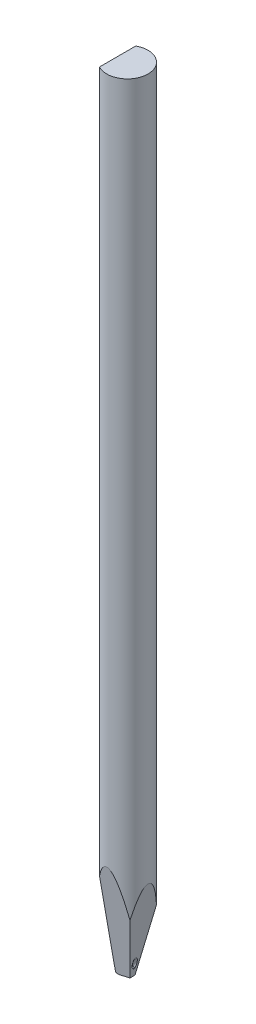
ISO-10303-21;
HEADER;
FILE_DESCRIPTION(('STEP AP214'),'2;1');
FILE_NAME('part.step','',(''),(''),'','','');
FILE_SCHEMA(('AUTOMOTIVE_DESIGN { 1 0 10303 214 1 1 1 1 }'));
ENDSEC;
DATA;
#1=APPLICATION_CONTEXT('core data for automotive mechanical design processes');
#2=APPLICATION_PROTOCOL_DEFINITION('international standard','automotive_design',2000,#1);
#3=PRODUCT_CONTEXT('',#1,'mechanical');
#4=PRODUCT('Part','Part','',(#3));
#5=PRODUCT_RELATED_PRODUCT_CATEGORY('part','',(#4));
#6=PRODUCT_DEFINITION_FORMATION('','',#4);
#7=PRODUCT_DEFINITION_CONTEXT('part definition',#1,'design');
#8=PRODUCT_DEFINITION('design','',#6,#7);
#9=PRODUCT_DEFINITION_SHAPE('','',#8);
#10=(LENGTH_UNIT() NAMED_UNIT(*) SI_UNIT(.MILLI.,.METRE.));
#11=(NAMED_UNIT(*) PLANE_ANGLE_UNIT() SI_UNIT($,.RADIAN.));
#12=(NAMED_UNIT(*) SI_UNIT($,.STERADIAN.) SOLID_ANGLE_UNIT());
#13=UNCERTAINTY_MEASURE_WITH_UNIT(LENGTH_MEASURE(1.E-05),#10,'distance_accuracy_value','');
#14=(GEOMETRIC_REPRESENTATION_CONTEXT(3) GLOBAL_UNCERTAINTY_ASSIGNED_CONTEXT((#13)) GLOBAL_UNIT_ASSIGNED_CONTEXT((#10,
#11,#12)) REPRESENTATION_CONTEXT('',''));
#15=CARTESIAN_POINT('',(0.,0.,0.));
#16=DIRECTION('',(0.,0.,1.));
#17=DIRECTION('',(1.,0.,0.));
#18=AXIS2_PLACEMENT_3D('',#15,#16,#17);
#19=CARTESIAN_POINT('',(38.6493213378097,0.,0.0762));
#20=DIRECTION('',(0.,-0.173648177666931,0.984807753012208));
#21=DIRECTION('',(0.,-0.984807753012208,-0.173648177666931));
#22=AXIS2_PLACEMENT_3D('',#19,#20,#21);
#23=PLANE('',#22);
#24=CARTESIAN_POINT('',(-0.32512,0.0508,0.0851574106199918));
#25=DIRECTION('',(0.,-0.173648177666931,0.984807753012208));
#26=DIRECTION('',(0.,-0.984807753012208,-0.173648177666931));
#27=AXIS2_PLACEMENT_3D('',#24,#25,#26);
#28=ELLIPSE('',#27,0.0515836718837959,0.0508);
#29=CARTESIAN_POINT('',(-0.32512,0.,0.0762000000000017));
#30=VERTEX_POINT('',#29);
#31=CARTESIAN_POINT('',(-0.37592,0.0508,0.0851574106199918));
#32=VERTEX_POINT('',#31);
#33=EDGE_CURVE('E68',#30,#32,#28,.F.);
#34=ORIENTED_EDGE('',*,*,#33,.F.);
#35=DIRECTION('',(-1.,0.,0.));
#36=VECTOR('',#35,1.);
#37=CARTESIAN_POINT('',(38.6493213378097,0.,0.0762));
#38=LINE('',#37,#36);
#39=CARTESIAN_POINT('',(-0.241300000000003,0.,0.0761999999999997));
#40=VERTEX_POINT('',#39);
#41=EDGE_CURVE('E417',#40,#30,#38,.T.);
#42=ORIENTED_EDGE('',*,*,#41,.F.);
#43=DIRECTION('',(-0.964921520309631,-0.258549942126377,-0.0455893306574928));
#44=VECTOR('',#43,1.);
#45=CARTESIAN_POINT('',(35.9687284956643,9.70244789332123,1.78700334251055));
#46=LINE('',#45,#44);
#47=CARTESIAN_POINT('',(0.195917050620486,0.117151955630876,0.0968570506204847));
#48=VERTEX_POINT('',#47);
#49=EDGE_CURVE('E414',#48,#40,#46,.T.);
#50=ORIENTED_EDGE('',*,*,#49,.F.);
#51=DIRECTION('',(-0.171087869746036,-0.970287525247814,-0.171087869746036));
#52=VECTOR('',#51,1.);
#53=CARTESIAN_POINT('',(1.30143652609224,6.3868644581071,1.20237652609224));
#54=LINE('',#53,#52);
#55=CARTESIAN_POINT('',(0.607704752474526,2.45251606269785,0.508644752474526));
#56=VERTEX_POINT('',#55);
#57=EDGE_CURVE('E411',#56,#48,#54,.T.);
#58=ORIENTED_EDGE('',*,*,#57,.F.);
#59=CARTESIAN_POINT('',(0.,-0.432151674654869,0.));
#60=DIRECTION('',(0.,-0.173648177666931,0.984807753012208));
#61=DIRECTION('',(0.,-0.984807753012208,-0.173648177666931));
#62=AXIS2_PLACEMENT_3D('',#59,#60,#61);
#63=ELLIPSE('',#62,4.56371043248163,0.792479999999998);
#64=CARTESIAN_POINT('',(-0.37592,3.52439037249585,0.69764511322018));
#65=VERTEX_POINT('',#64);
#66=EDGE_CURVE('E422',#56,#65,#63,.T.);
#67=ORIENTED_EDGE('',*,*,#66,.T.);
#68=DIRECTION('',(0.,0.984807753012208,0.173648177666931));
#69=VECTOR('',#68,1.);
#70=CARTESIAN_POINT('',(-0.37592,29.4106524144287,5.26209154090237));
#71=LINE('',#70,#69);
#72=EDGE_CURVE('E437',#32,#65,#71,.T.);
#73=ORIENTED_EDGE('',*,*,#72,.F.);
#74=EDGE_LOOP('',(#34,#42,#50,#58,#67,#73));
#75=FACE_BOUND('',#74,.T.);
#76=ADVANCED_FACE('F46',(#75),#23,.T.);
#77=CARTESIAN_POINT('',(38.6493213378097,0.,-0.0762));
#78=DIRECTION('',(0.,-0.173648177666931,-0.984807753012208));
#79=DIRECTION('',(0.,0.984807753012208,-0.173648177666931));
#80=AXIS2_PLACEMENT_3D('',#77,#78,#79);
#81=PLANE('',#80);
#82=CARTESIAN_POINT('',(-0.32512,0.0508,-0.0851574106199918));
#83=DIRECTION('',(0.,-0.173648177666931,-0.984807753012208));
#84=DIRECTION('',(0.,0.984807753012208,-0.173648177666931));
#85=AXIS2_PLACEMENT_3D('',#82,#83,#84);
#86=ELLIPSE('',#85,0.0515836718837959,0.0508);
#87=CARTESIAN_POINT('',(-0.37592,0.0508,-0.0851574106199918));
#88=VERTEX_POINT('',#87);
#89=CARTESIAN_POINT('',(-0.32512,0.,-0.0762000000000017));
#90=VERTEX_POINT('',#89);
#91=EDGE_CURVE('E482',#88,#90,#86,.F.);
#92=ORIENTED_EDGE('',*,*,#91,.F.);
#93=DIRECTION('',(0.,-0.984807753012208,0.173648177666931));
#94=VECTOR('',#93,1.);
#95=CARTESIAN_POINT('',(-0.37592,29.6851167322043,-5.31048700536795));
#96=LINE('',#95,#94);
#97=CARTESIAN_POINT('',(-0.37592,3.52439037249585,-0.69764511322018));
#98=VERTEX_POINT('',#97);
#99=EDGE_CURVE('E439',#98,#88,#96,.T.);
#100=ORIENTED_EDGE('',*,*,#99,.F.);
#101=CARTESIAN_POINT('',(0.,-0.432151674654869,0.));
#102=DIRECTION('',(0.,-0.173648177666931,-0.984807753012208));
#103=DIRECTION('',(0.,-0.984807753012208,0.173648177666931));
#104=AXIS2_PLACEMENT_3D('',#101,#102,#103);
#105=ELLIPSE('',#104,4.56371043248163,0.792479999999998);
#106=CARTESIAN_POINT('',(0.607704752474526,2.45251606269785,-0.508644752474526));
#107=VERTEX_POINT('',#106);
#108=EDGE_CURVE('E425',#98,#107,#105,.T.);
#109=ORIENTED_EDGE('',*,*,#108,.T.);
#110=DIRECTION('',(0.171087869746036,0.970287525247814,-0.171087869746036));
#111=VECTOR('',#110,1.);
#112=CARTESIAN_POINT('',(1.30143652609224,6.3868644581071,-1.20237652609224));
#113=LINE('',#112,#111);
#114=CARTESIAN_POINT('',(0.195917050620486,0.117151955630876,-0.0968570506204847));
#115=VERTEX_POINT('',#114);
#116=EDGE_CURVE('E441',#115,#107,#113,.T.);
#117=ORIENTED_EDGE('',*,*,#116,.F.);
#118=DIRECTION('',(0.964921520309631,0.258549942126377,-0.0455893306574928));
#119=VECTOR('',#118,1.);
#120=CARTESIAN_POINT('',(35.9687284956643,9.70244789332123,-1.78700334251055));
#121=LINE('',#120,#119);
#122=CARTESIAN_POINT('',(-0.241300000000003,0.,-0.0761999999999997));
#123=VERTEX_POINT('',#122);
#124=EDGE_CURVE('E444',#123,#115,#121,.T.);
#125=ORIENTED_EDGE('',*,*,#124,.F.);
#126=DIRECTION('',(-1.,0.,0.));
#127=VECTOR('',#126,1.);
#128=CARTESIAN_POINT('',(38.6493213378097,0.,-0.0762));
#129=LINE('',#128,#127);
#130=EDGE_CURVE('E419',#123,#90,#129,.T.);
#131=ORIENTED_EDGE('',*,*,#130,.T.);
#132=EDGE_LOOP('',(#92,#100,#109,#117,#125,#131));
#133=FACE_BOUND('',#132,.T.);
#134=ADVANCED_FACE('F291',(#133),#81,.T.);
#135=CARTESIAN_POINT('',(-0.375920000000002,0.,0.02794));
#136=DIRECTION('',(0.,0.499999999999998,0.86602540378444));
#137=DIRECTION('',(0.,-0.86602540378444,0.499999999999998));
#138=AXIS2_PLACEMENT_3D('',#135,#136,#137);
#139=PLANE('',#138);
#140=DIRECTION('',(1.,0.,0.));
#141=VECTOR('',#140,1.);
#142=CARTESIAN_POINT('',(-0.375920000000002,0.,0.02794));
#143=LINE('',#142,#141);
#144=CARTESIAN_POINT('',(-0.32512,0.,0.0279399999999927));
#145=VERTEX_POINT('',#144);
#146=CARTESIAN_POINT('',(-0.255156139621714,0.,0.02794));
#147=VERTEX_POINT('',#146);
#148=EDGE_CURVE('E393',#145,#147,#143,.T.);
#149=ORIENTED_EDGE('',*,*,#148,.F.);
#150=CARTESIAN_POINT('',(-0.32512,0.0508,-0.0013893936748402));
#151=DIRECTION('',(0.,0.499999999999998,0.86602540378444));
#152=DIRECTION('',(0.,0.86602540378444,-0.499999999999998));
#153=AXIS2_PLACEMENT_3D('',#150,#151,#152);
#154=ELLIPSE('',#153,0.0586587873496659,0.0508);
#155=CARTESIAN_POINT('',(-0.355777192017303,0.0102934995634744,0.0219970452561248));
#156=VERTEX_POINT('',#155);
#157=EDGE_CURVE('E205',#145,#156,#154,.F.);
#158=ORIENTED_EDGE('',*,*,#157,.T.);
#159=DIRECTION('',(1.,0.,0.));
#160=VECTOR('',#159,1.);
#161=CARTESIAN_POINT('',(-0.375920000000002,0.0102934995634744,0.0219970452561248));
#162=LINE('',#161,#160);
#163=CARTESIAN_POINT('',(-0.255223979228152,0.0102934995634744,0.0219970452561248));
#164=VERTEX_POINT('',#163);
#165=EDGE_CURVE('E54',#156,#164,#162,.T.);
#166=ORIENTED_EDGE('',*,*,#165,.T.);
#167=CARTESIAN_POINT('',(-0.19730590948775,0.0483934995634747,0.));
#168=DIRECTION('',(0.,0.499999999999998,0.86602540378444));
#169=DIRECTION('',(-0.554700196225233,-0.720576692122891,0.416025147168919));
#170=AXIS2_PLACEMENT_3D('',#167,#168,#169);
#171=ELLIPSE('',#170,0.0879881810244995,0.0381);
#172=EDGE_CURVE('E252',#164,#147,#171,.T.);
#173=ORIENTED_EDGE('',*,*,#172,.T.);
#174=EDGE_LOOP('',(#149,#158,#166,#173));
#175=FACE_BOUND('',#174,.T.);
#176=ADVANCED_FACE('F288',(#175),#139,.F.);
#177=CARTESIAN_POINT('',(-0.375920000000002,0.0102934995634744,-0.0219970452561248));
#178=DIRECTION('',(0.,0.499999999999998,-0.86602540378444));
#179=DIRECTION('',(0.,0.86602540378444,0.499999999999998));
#180=AXIS2_PLACEMENT_3D('',#177,#178,#179);
#181=PLANE('',#180);
#182=DIRECTION('',(1.,0.,0.));
#183=VECTOR('',#182,1.);
#184=CARTESIAN_POINT('',(-0.375920000000002,0.0102934995634744,-0.0219970452561248));
#185=LINE('',#184,#183);
#186=CARTESIAN_POINT('',(-0.355777192017306,0.0102934995634744,-0.0219970452561248));
#187=VERTEX_POINT('',#186);
#188=CARTESIAN_POINT('',(-0.255223979228152,0.0102934995634744,-0.0219970452561248));
#189=VERTEX_POINT('',#188);
#190=EDGE_CURVE('E244',#187,#189,#185,.T.);
#191=ORIENTED_EDGE('',*,*,#190,.F.);
#192=CARTESIAN_POINT('',(-0.32512,0.0508,0.00138939367482632));
#193=DIRECTION('',(0.,0.499999999999998,-0.86602540378444));
#194=DIRECTION('',(0.,-0.86602540378444,-0.499999999999998));
#195=AXIS2_PLACEMENT_3D('',#192,#193,#194);
#196=ELLIPSE('',#195,0.0586587873496659,0.0508);
#197=CARTESIAN_POINT('',(-0.32512,0.,-0.0279400000000065));
#198=VERTEX_POINT('',#197);
#199=EDGE_CURVE('E212',#187,#198,#196,.F.);
#200=ORIENTED_EDGE('',*,*,#199,.T.);
#201=DIRECTION('',(1.,0.,0.));
#202=VECTOR('',#201,1.);
#203=CARTESIAN_POINT('',(-0.375920000000002,0.,-0.02794));
#204=LINE('',#203,#202);
#205=CARTESIAN_POINT('',(-0.255156139621714,0.,-0.02794));
#206=VERTEX_POINT('',#205);
#207=EDGE_CURVE('E246',#198,#206,#204,.T.);
#208=ORIENTED_EDGE('',*,*,#207,.T.);
#209=CARTESIAN_POINT('',(-0.19730590948775,0.0483934995634747,0.));
#210=DIRECTION('',(0.,0.499999999999998,-0.86602540378444));
#211=DIRECTION('',(-0.554700196225232,-0.720576692122891,-0.416025147168919));
#212=AXIS2_PLACEMENT_3D('',#209,#210,#211);
#213=ELLIPSE('',#212,0.0879881810244996,0.0381);
#214=EDGE_CURVE('E447',#206,#189,#213,.T.);
#215=ORIENTED_EDGE('',*,*,#214,.T.);
#216=EDGE_LOOP('',(#191,#200,#208,#215));
#217=FACE_BOUND('',#216,.T.);
#218=ADVANCED_FACE('F290',(#217),#181,.F.);
#219=CARTESIAN_POINT('',(0.,0.,0.));
#220=DIRECTION('',(0.,1.,0.));
#221=DIRECTION('',(0.,0.,1.));
#222=AXIS2_PLACEMENT_3D('',#219,#220,#221);
#223=PLANE('',#222);
#224=ORIENTED_EDGE('',*,*,#41,.T.);
#225=DIRECTION('',(0.,0.,-1.));
#226=VECTOR('',#225,1.);
#227=CARTESIAN_POINT('',(-0.32512,0.,38.2146171183694));
#228=LINE('',#227,#226);
#229=EDGE_CURVE('E214',#30,#145,#228,.T.);
#230=ORIENTED_EDGE('',*,*,#229,.T.);
#231=ORIENTED_EDGE('',*,*,#148,.T.);
#232=CARTESIAN_POINT('',(-0.22524590948775,0.,0.));
#233=DIRECTION('',(0.,1.,0.));
#234=DIRECTION('',(-1.,0.,0.));
#235=AXIS2_PLACEMENT_3D('',#232,#233,#234);
#236=ELLIPSE('',#235,0.0439940905122496,0.0381);
#237=CARTESIAN_POINT('',(-0.2413,0.,0.0354726603649658));
#238=VERTEX_POINT('',#237);
#239=EDGE_CURVE('E256',#238,#147,#236,.F.);
#240=ORIENTED_EDGE('',*,*,#239,.F.);
#241=DIRECTION('',(0.,0.,-1.));
#242=VECTOR('',#241,1.);
#243=CARTESIAN_POINT('',(-0.2413,0.,39.0514777293349));
#244=LINE('',#243,#242);
#245=EDGE_CURVE('E405',#40,#238,#244,.T.);
#246=ORIENTED_EDGE('',*,*,#245,.F.);
#247=EDGE_LOOP('',(#224,#230,#231,#240,#246));
#248=FACE_BOUND('',#247,.T.);
#249=ADVANCED_FACE('F297',(#248),#223,.F.);
#250=ORIENTED_EDGE('',*,*,#207,.F.);
#251=EDGE_CURVE('E216',#198,#90,#228,.T.);
#252=ORIENTED_EDGE('',*,*,#251,.T.);
#253=ORIENTED_EDGE('',*,*,#130,.F.);
#254=CARTESIAN_POINT('',(-0.2413,0.,-0.0354726603649658));
#255=VERTEX_POINT('',#254);
#256=EDGE_CURVE('E398',#255,#123,#244,.T.);
#257=ORIENTED_EDGE('',*,*,#256,.F.);
#258=EDGE_CURVE('E480',#206,#255,#236,.F.);
#259=ORIENTED_EDGE('',*,*,#258,.F.);
#260=EDGE_LOOP('',(#250,#252,#253,#257,#259));
#261=FACE_BOUND('',#260,.T.);
#262=ADVANCED_FACE('F318',(#261),#223,.F.);
#263=CARTESIAN_POINT('',(0.,30.48,0.));
#264=DIRECTION('',(0.,-1.,0.));
#265=DIRECTION('',(0.,0.,-1.));
#266=AXIS2_PLACEMENT_3D('',#263,#264,#265);
#267=CYLINDRICAL_SURFACE('',#266,0.792479999999998);
#268=ORIENTED_EDGE('',*,*,#66,.F.);
#269=CARTESIAN_POINT('',(0.,-0.993948851706197,0.));
#270=DIRECTION('',(-0.984807753012208,0.173648177666931,0.));
#271=DIRECTION('',(-0.173648177666931,-0.984807753012208,0.));
#272=AXIS2_PLACEMENT_3D('',#269,#270,#271);
#273=ELLIPSE('',#272,4.56371043248165,0.792479999999998);
#274=EDGE_CURVE('E408',#56,#107,#273,.T.);
#275=ORIENTED_EDGE('',*,*,#274,.T.);
#276=ORIENTED_EDGE('',*,*,#108,.F.);
#277=DIRECTION('',(0.,-1.,0.));
#278=VECTOR('',#277,1.);
#279=CARTESIAN_POINT('',(-0.37592,30.48,-0.69764511322018));
#280=LINE('',#279,#278);
#281=CARTESIAN_POINT('',(-0.37592,30.48,-0.69764511322018));
#282=VERTEX_POINT('',#281);
#283=EDGE_CURVE('E431',#282,#98,#280,.T.);
#284=ORIENTED_EDGE('',*,*,#283,.F.);
#285=CARTESIAN_POINT('',(0.,30.48,0.));
#286=DIRECTION('',(0.,1.,0.));
#287=DIRECTION('',(0.,0.,1.));
#288=AXIS2_PLACEMENT_3D('',#285,#286,#287);
#289=CIRCLE('',#288,0.792479999999998);
#290=CARTESIAN_POINT('',(-0.37592,30.48,0.69764511322018));
#291=VERTEX_POINT('',#290);
#292=EDGE_CURVE('E434',#291,#282,#289,.T.);
#293=ORIENTED_EDGE('',*,*,#292,.F.);
#294=DIRECTION('',(0.,-1.,0.));
#295=VECTOR('',#294,1.);
#296=CARTESIAN_POINT('',(-0.37592,30.48,0.69764511322018));
#297=LINE('',#296,#295);
#298=EDGE_CURVE('E429',#65,#291,#297,.F.);
#299=ORIENTED_EDGE('',*,*,#298,.F.);
#300=EDGE_LOOP('',(#268,#275,#276,#284,#293,#299));
#301=FACE_BOUND('',#300,.T.);
#302=ADVANCED_FACE('F314',(#301),#267,.T.);
#303=CARTESIAN_POINT('',(-0.37592,30.48,-0.80247998));
#304=DIRECTION('',(-1.,0.,0.));
#305=DIRECTION('',(0.,0.,1.));
#306=AXIS2_PLACEMENT_3D('',#303,#304,#305);
#307=PLANE('',#306);
#308=DIRECTION('',(0.,0.,-1.));
#309=VECTOR('',#308,1.);
#310=CARTESIAN_POINT('',(-0.37592,0.0508,38.2146171183694));
#311=LINE('',#310,#309);
#312=EDGE_CURVE('E76',#32,#88,#311,.T.);
#313=ORIENTED_EDGE('',*,*,#312,.F.);
#314=ORIENTED_EDGE('',*,*,#72,.T.);
#315=ORIENTED_EDGE('',*,*,#298,.T.);
#316=DIRECTION('',(0.,0.,-1.));
#317=VECTOR('',#316,1.);
#318=CARTESIAN_POINT('',(-0.37592,30.48,-0.80247998));
#319=LINE('',#318,#317);
#320=EDGE_CURVE('E427',#291,#282,#319,.T.);
#321=ORIENTED_EDGE('',*,*,#320,.T.);
#322=ORIENTED_EDGE('',*,*,#283,.T.);
#323=ORIENTED_EDGE('',*,*,#99,.T.);
#324=EDGE_LOOP('',(#313,#314,#315,#321,#322,#323));
#325=FACE_BOUND('',#324,.T.);
#326=ADVANCED_FACE('F310',(#325),#307,.T.);
#327=CARTESIAN_POINT('',(0.,30.48,0.));
#328=DIRECTION('',(0.,1.,0.));
#329=DIRECTION('',(0.,0.,1.));
#330=AXIS2_PLACEMENT_3D('',#327,#328,#329);
#331=PLANE('',#330);
#332=ORIENTED_EDGE('',*,*,#292,.T.);
#333=ORIENTED_EDGE('',*,*,#320,.F.);
#334=EDGE_LOOP('',(#332,#333));
#335=FACE_BOUND('',#334,.T.);
#336=ADVANCED_FACE('F313',(#335),#331,.T.);
#337=CARTESIAN_POINT('',(-0.2413,0.,39.0514777293349));
#338=DIRECTION('',(-0.258819045102522,0.965925826289068,0.));
#339=DIRECTION('',(-0.965925826289068,-0.258819045102522,0.));
#340=AXIS2_PLACEMENT_3D('',#337,#338,#339);
#341=PLANE('',#340);
#342=ORIENTED_EDGE('',*,*,#245,.T.);
#343=CARTESIAN_POINT('',(-0.222307807006681,0.00508894277505577,0.));
#344=DIRECTION('',(-0.258819045102522,0.965925826289068,0.));
#345=DIRECTION('',(-0.965925826289068,-0.258819045102522,0.));
#346=AXIS2_PLACEMENT_3D('',#343,#344,#345);
#347=ELLIPSE('',#346,0.0538815367264152,0.0381);
#348=CARTESIAN_POINT('',(-0.222307807006681,0.00508894277505577,0.0380999999999996));
#349=VERTEX_POINT('',#348);
#350=EDGE_CURVE('E450',#238,#349,#347,.T.);
#351=ORIENTED_EDGE('',*,*,#350,.T.);
#352=DIRECTION('',(-0.965925826289068,-0.258819045102522,0.));
#353=VECTOR('',#352,1.);
#354=CARTESIAN_POINT('',(-0.2413,0.,0.0380999999999992));
#355=LINE('',#354,#353);
#356=CARTESIAN_POINT('',(-0.0152400000000001,0.0605725944409798,0.0380999999999996));
#357=VERTEX_POINT('',#356);
#358=EDGE_CURVE('E388',#357,#349,#355,.T.);
#359=ORIENTED_EDGE('',*,*,#358,.F.);
#360=DIRECTION('',(0.,0.,1.));
#361=VECTOR('',#360,1.);
#362=CARTESIAN_POINT('',(-0.0152400000000001,0.0605725944409798,39.0514777293349));
#363=LINE('',#362,#361);
#364=CARTESIAN_POINT('',(-0.0152400000000001,0.0605725944409798,-0.0380999999999996));
#365=VERTEX_POINT('',#364);
#366=EDGE_CURVE('E454',#365,#357,#363,.T.);
#367=ORIENTED_EDGE('',*,*,#366,.F.);
#368=DIRECTION('',(-0.965925826289068,-0.258819045102522,0.));
#369=VECTOR('',#368,1.);
#370=CARTESIAN_POINT('',(-0.2413,0.,-0.0380999999999992));
#371=LINE('',#370,#369);
#372=CARTESIAN_POINT('',(-0.222307807006681,0.00508894277505579,-0.0380999999999996));
#373=VERTEX_POINT('',#372);
#374=EDGE_CURVE('E451',#365,#373,#371,.T.);
#375=ORIENTED_EDGE('',*,*,#374,.T.);
#376=EDGE_CURVE('E255',#373,#255,#347,.T.);
#377=ORIENTED_EDGE('',*,*,#376,.T.);
#378=ORIENTED_EDGE('',*,*,#256,.T.);
#379=ORIENTED_EDGE('',*,*,#124,.T.);
#380=DIRECTION('',(0.,0.,-1.));
#381=VECTOR('',#380,1.);
#382=CARTESIAN_POINT('',(0.195917050620484,0.117151955630877,39.0514777293349));
#383=LINE('',#382,#381);
#384=EDGE_CURVE('E394',#48,#115,#383,.T.);
#385=ORIENTED_EDGE('',*,*,#384,.F.);
#386=ORIENTED_EDGE('',*,*,#49,.T.);
#387=EDGE_LOOP('',(#342,#351,#359,#367,#375,#377,#378,#379,#385,#386));
#388=FACE_BOUND('',#387,.T.);
#389=ADVANCED_FACE('F307',(#388),#341,.F.);
#390=CARTESIAN_POINT('',(0.195917050620484,0.117151955630877,39.0514777293349));
#391=DIRECTION('',(-0.984807753012208,0.173648177666931,0.));
#392=DIRECTION('',(-0.173648177666931,-0.984807753012208,0.));
#393=AXIS2_PLACEMENT_3D('',#390,#391,#392);
#394=PLANE('',#393);
#395=CARTESIAN_POINT('',(0.281397331604712,0.601934719112537,0.));
#396=DIRECTION('',(-0.984807753012208,0.173648177666931,0.));
#397=DIRECTION('',(0.173648177666931,0.984807753012208,0.));
#398=AXIS2_PLACEMENT_3D('',#395,#396,#397);
#399=ELLIPSE('',#398,0.202183515578444,0.0935003785343583);
#400=CARTESIAN_POINT('',(0.316506130639202,0.801046612785453,0.));
#401=VERTEX_POINT('',#400);
#402=EDGE_CURVE('E403',#401,#401,#399,.F.);
#403=ORIENTED_EDGE('',*,*,#402,.F.);
#404=EDGE_LOOP('',(#403));
#405=FACE_BOUND('',#404,.T.);
#406=ORIENTED_EDGE('',*,*,#274,.F.);
#407=ORIENTED_EDGE('',*,*,#57,.T.);
#408=ORIENTED_EDGE('',*,*,#384,.T.);
#409=ORIENTED_EDGE('',*,*,#116,.T.);
#410=EDGE_LOOP('',(#406,#407,#408,#409));
#411=FACE_BOUND('',#410,.T.);
#412=ADVANCED_FACE('F577',(#405,#411),#394,.F.);
#413=CARTESIAN_POINT('',(-0.375920000000002,-0.00240650043652551,0.));
#414=DIRECTION('',(1.,0.,0.));
#415=DIRECTION('',(0.,0.,-1.));
#416=AXIS2_PLACEMENT_3D('',#413,#414,#415);
#417=CYLINDRICAL_SURFACE('',#416,0.0254);
#418=ORIENTED_EDGE('',*,*,#165,.F.);
#419=CARTESIAN_POINT('',(-0.355777192017281,0.0102934995634582,0.0219970452561342));
#420=CARTESIAN_POINT('',(-0.356897506758149,0.0111382333345344,0.0215102767995388));
#421=CARTESIAN_POINT('',(-0.357959364560408,0.0120178983620328,0.0209365131040323));
#422=CARTESIAN_POINT('',(-0.359948169598718,0.0137951368126314,0.0195935481232055));
#423=CARTESIAN_POINT('',(-0.360874227541202,0.0146927880160747,0.0188231418931034));
#424=CARTESIAN_POINT('',(-0.362564583958771,0.0164480441904997,0.0170650442521407));
#425=CARTESIAN_POINT('',(-0.363327716591907,0.0173053284187433,0.0160758836099099));
#426=CARTESIAN_POINT('',(-0.364666012957556,0.0188965230331408,0.013897805568381));
#427=CARTESIAN_POINT('',(-0.365241860716513,0.0196308775171999,0.0127096396622511));
#428=CARTESIAN_POINT('',(-0.366141085408193,0.0208267273040765,0.0103391708506556));
#429=CARTESIAN_POINT('',(-0.366487980815477,0.0213116208054562,0.00917750420896743));
#430=CARTESIAN_POINT('',(-0.367045134166993,0.0221091990654056,0.00676421887909321));
#431=CARTESIAN_POINT('',(-0.367255295955485,0.0224217626121618,0.00551253757499208));
#432=CARTESIAN_POINT('',(-0.367532731202619,0.0228382740127658,0.00305127054038452));
#433=CARTESIAN_POINT('',(-0.367608984240567,0.0229553038487369,0.00184487979962939));
#434=CARTESIAN_POINT('',(-0.367648569413078,0.0230157866563225,-0.000573634748391043));
#435=CARTESIAN_POINT('',(-0.367611955478027,0.0229593225273086,-0.00178575554134157));
#436=CARTESIAN_POINT('',(-0.367426062655835,0.0226776884275995,-0.00416710022693685));
#437=CARTESIAN_POINT('',(-0.367278084000554,0.022454465656123,-0.0053366570969131));
#438=CARTESIAN_POINT('',(-0.366867968064253,0.0218538732504223,-0.0076145582222737));
#439=CARTESIAN_POINT('',(-0.36660582620177,0.0214764974299475,-0.00872290001903533));
#440=CARTESIAN_POINT('',(-0.365962334852267,0.0205866745755416,-0.0108542410743825));
#441=CARTESIAN_POINT('',(-0.365580354877547,0.0200735154530778,-0.0118767518347564));
#442=CARTESIAN_POINT('',(-0.364696727834242,0.0189435363974493,-0.0138052745256558));
#443=CARTESIAN_POINT('',(-0.364195111080501,0.0183267427359919,-0.0147113158790819));
#444=CARTESIAN_POINT('',(-0.36305481672829,0.0170008493560201,-0.0164234611595084));
#445=CARTESIAN_POINT('',(-0.362411777196039,0.0162891892774924,-0.0172246647097102));
#446=CARTESIAN_POINT('',(-0.361009199588909,0.0148331219035069,-0.0186820668489172));
#447=CARTESIAN_POINT('',(-0.360249533840548,0.0140886793650823,-0.0193381045763725));
#448=CARTESIAN_POINT('',(-0.358311130020784,0.0123111425027417,-0.0207435732320806));
#449=CARTESIAN_POINT('',(-0.357084580560832,0.0112788410358154,-0.0214294475133679));
#450=CARTESIAN_POINT('',(-0.355777192022161,0.0102934995630371,-0.0219970452622823));
#451=B_SPLINE_CURVE_WITH_KNOTS('',3,(#419,#420,#421,#422,#423,#424,#425,#426,#427,#428,#429,
#430,#431,#432,#433,#434,#435,#436,#437,#438,#439,#440,#441,#442,#443,#444,#445,#446,#447,#448,
#449,#450),.UNSPECIFIED.,.F.,.F.,(4,2,2,2,2,2,2,2,2,2,2,2,2,2,2,4),(0.,0.00445833921989925,
0.00894468214029065,0.0134621250529331,0.0179628784811104,0.0218592766679201,0.0257584119814633,
0.0293843607519162,0.03300857723086,0.03659112343515,0.0401738134232079,0.0437756778837301,
0.0473766306332142,0.0511100051136513,0.054847496140866,0.0600443644275329),.UNSPECIFIED.);
#452=CARTESIAN_POINT('',(-0.363315096791987,0.0173239368664957,0.0159942904877789));
#453=VERTEX_POINT('',#452);
#454=EDGE_CURVE('E200',#156,#453,#451,.T.);
#455=ORIENTED_EDGE('',*,*,#454,.T.);
#456=CARTESIAN_POINT('',(-0.37592,0.0102934995634744,-0.0219970452561248));
#457=CARTESIAN_POINT('',(-0.369569798070561,0.0141311966671354,-0.0197813498002579));
#458=CARTESIAN_POINT('',(-0.363217008232766,0.0173745492397743,-0.0165382169336048));
#459=CARTESIAN_POINT('',(-0.353697991767233,0.0218065403994241,-0.0088617830663952));
#460=CARTESIAN_POINT('',(-0.35052,0.0229934995634745,-0.00442283642435689));
#461=CARTESIAN_POINT('',(-0.35052,0.0229934995634745,0.00442283642435697));
#462=CARTESIAN_POINT('',(-0.353697991767233,0.0218065403994241,0.00886178306639529));
#463=CARTESIAN_POINT('',(-0.363217008232766,0.0173745492397743,0.0165382169336048));
#464=CARTESIAN_POINT('',(-0.369569798070561,0.0141311966671356,0.0197813498002578));
#465=CARTESIAN_POINT('',(-0.37592,0.0102934995634744,0.0219970452561248));
#466=(BOUNDED_CURVE() B_SPLINE_CURVE(3,(#456,#457,#458,#459,#460,#461,#462,#463,#464,#465),
.UNSPECIFIED.,.F.,.F.) B_SPLINE_CURVE_WITH_KNOTS((4,2,2,2,4),(3.66519142918809,4.18879020478639,
4.71238898038469,5.23598775598299,5.75958653158129),
.UNSPECIFIED.) CURVE() GEOMETRIC_REPRESENTATION_ITEM() RATIONAL_B_SPLINE_CURVE((1.,1.,1.,1.,1.,
1.,1.,1.,1.,1.)) REPRESENTATION_ITEM(''));
#467=CARTESIAN_POINT('',(-0.36331971310046,0.0173215990313243,-0.0159971552315507));
#468=VERTEX_POINT('',#467);
#469=EDGE_CURVE('E60',#453,#468,#466,.F.);
#470=ORIENTED_EDGE('',*,*,#469,.T.);
#471=EDGE_CURVE('E206',#468,#187,#451,.T.);
#472=ORIENTED_EDGE('',*,*,#471,.T.);
#473=ORIENTED_EDGE('',*,*,#190,.T.);
#474=CARTESIAN_POINT('',(-0.255223979228154,0.0102934995634582,0.0219970452561342));
#475=CARTESIAN_POINT('',(-0.258632221061746,0.0142994444352138,0.0196842119060712));
#476=CARTESIAN_POINT('',(-0.263795630476338,0.0171677640360435,0.0167530393669271));
#477=CARTESIAN_POINT('',(-0.273639026010204,0.0216051054798955,0.00934124932685019));
#478=CARTESIAN_POINT('',(-0.27796431872125,0.0229937489838684,0.00471136202422672));
#479=CARTESIAN_POINT('',(-0.277959165397351,0.0229932500719133,-0.00471405100212225));
#480=CARTESIAN_POINT('',(-0.273626024291389,0.0215887905236355,-0.00937809016700787));
#481=CARTESIAN_POINT('',(-0.263790669209007,0.0171541152544561,-0.0167661825480054));
#482=CARTESIAN_POINT('',(-0.258611158336117,0.0142753227786995,-0.0196981385509493));
#483=CARTESIAN_POINT('',(-0.255223979228152,0.0102934995634735,-0.0219970452561253));
#484=(BOUNDED_CURVE() B_SPLINE_CURVE(3,(#474,#475,#476,#477,#478,#479,#480,#481,#482,#483),
.UNSPECIFIED.,.F.,.F.) B_SPLINE_CURVE_WITH_KNOTS((4,2,2,2,4),(0.,1.3240080529018E-05,
2.64801610580349E-05,3.97202415870518E-05,5.29603221160687E-05),
.UNSPECIFIED.) CURVE() GEOMETRIC_REPRESENTATION_ITEM() RATIONAL_B_SPLINE_CURVE((1.,1.,1.,1.,1.,
1.,1.,1.,1.,1.)) REPRESENTATION_ITEM(''));
#485=EDGE_CURVE('E386',#189,#164,#484,.F.);
#486=ORIENTED_EDGE('',*,*,#485,.T.);
#487=EDGE_LOOP('',(#418,#455,#470,#472,#473,#486));
#488=FACE_BOUND('',#487,.T.);
#489=ADVANCED_FACE('F201',(#488),#417,.F.);
#490=CARTESIAN_POINT('',(-0.0152400000000001,0.20828,0.0381));
#491=DIRECTION('',(-1.,0.,0.));
#492=DIRECTION('',(0.,-1.,0.));
#493=AXIS2_PLACEMENT_3D('',#490,#491,#492);
#494=PLANE('',#493);
#495=ORIENTED_EDGE('',*,*,#366,.T.);
#496=DIRECTION('',(0.,1.,0.));
#497=VECTOR('',#496,1.);
#498=CARTESIAN_POINT('',(-0.0152400000000001,0.20828,0.0381));
#499=LINE('',#498,#497);
#500=CARTESIAN_POINT('',(-0.0152400000000001,0.175901226088686,0.0381));
#501=VERTEX_POINT('',#500);
#502=EDGE_CURVE('E465',#357,#501,#499,.T.);
#503=ORIENTED_EDGE('',*,*,#502,.T.);
#504=CARTESIAN_POINT('',(-0.0152400000000001,0.20828,0.));
#505=DIRECTION('',(1.,0.,0.));
#506=DIRECTION('',(0.,1.,0.));
#507=AXIS2_PLACEMENT_3D('',#504,#505,#506);
#508=ELLIPSE('',#507,0.0628617928474838,0.0444500000000001);
#509=CARTESIAN_POINT('',(-0.0152400000000001,0.175901226088686,-0.0381));
#510=VERTEX_POINT('',#509);
#511=EDGE_CURVE('E504',#510,#501,#508,.F.);
#512=ORIENTED_EDGE('',*,*,#511,.F.);
#513=DIRECTION('',(0.,1.,0.));
#514=VECTOR('',#513,1.);
#515=CARTESIAN_POINT('',(-0.0152400000000001,0.20828,-0.0381));
#516=LINE('',#515,#514);
#517=EDGE_CURVE('E514',#365,#510,#516,.T.);
#518=ORIENTED_EDGE('',*,*,#517,.F.);
#519=EDGE_LOOP('',(#495,#503,#512,#518));
#520=FACE_BOUND('',#519,.T.);
#521=ADVANCED_FACE('F546',(#520),#494,.T.);
#522=CARTESIAN_POINT('',(0.,0.,0.0381));
#523=DIRECTION('',(0.,0.,-1.));
#524=DIRECTION('',(-1.,0.,0.));
#525=AXIS2_PLACEMENT_3D('',#522,#523,#524);
#526=PLANE('',#525);
#527=ORIENTED_EDGE('',*,*,#358,.T.);
#528=DIRECTION('',(-0.500000000000004,-0.866025403784436,0.));
#529=VECTOR('',#528,1.);
#530=CARTESIAN_POINT('',(-0.168934432115812,0.0975343398574616,0.0381));
#531=LINE('',#530,#529);
#532=CARTESIAN_POINT('',(-0.104995395420934,0.20828,0.0381));
#533=VERTEX_POINT('',#532);
#534=EDGE_CURVE('E462',#533,#349,#531,.T.);
#535=ORIENTED_EDGE('',*,*,#534,.F.);
#536=DIRECTION('',(-1.,0.,0.));
#537=VECTOR('',#536,1.);
#538=CARTESIAN_POINT('',(-0.148989485933184,0.20828,0.0381));
#539=LINE('',#538,#537);
#540=CARTESIAN_POINT('',(-0.0476187739113147,0.20828,0.0381));
#541=VERTEX_POINT('',#540);
#542=EDGE_CURVE('E508',#541,#533,#539,.T.);
#543=ORIENTED_EDGE('',*,*,#542,.F.);
#544=CARTESIAN_POINT('',(-0.0152400000000001,0.20828,0.0380999999999992));
#545=VERTEX_POINT('',#544);
#546=EDGE_CURVE('E505',#545,#541,#539,.T.);
#547=ORIENTED_EDGE('',*,*,#546,.F.);
#548=EDGE_CURVE('E503',#501,#545,#499,.T.);
#549=ORIENTED_EDGE('',*,*,#548,.F.);
#550=ORIENTED_EDGE('',*,*,#502,.F.);
#551=EDGE_LOOP('',(#527,#535,#543,#547,#549,#550));
#552=FACE_BOUND('',#551,.T.);
#553=ADVANCED_FACE('F460',(#552),#526,.T.);
#554=CARTESIAN_POINT('',(0.,0.,-0.0381));
#555=DIRECTION('',(0.,0.,-1.));
#556=DIRECTION('',(-1.,0.,0.));
#557=AXIS2_PLACEMENT_3D('',#554,#555,#556);
#558=PLANE('',#557);
#559=ORIENTED_EDGE('',*,*,#517,.T.);
#560=CARTESIAN_POINT('',(-0.0152400000000001,0.20828,-0.0380999999999992));
#561=VERTEX_POINT('',#560);
#562=EDGE_CURVE('E512',#510,#561,#516,.T.);
#563=ORIENTED_EDGE('',*,*,#562,.T.);
#564=DIRECTION('',(-1.,0.,0.));
#565=VECTOR('',#564,1.);
#566=CARTESIAN_POINT('',(-0.148989485933184,0.20828,-0.0381));
#567=LINE('',#566,#565);
#568=CARTESIAN_POINT('',(-0.0476187739113147,0.20828,-0.0381));
#569=VERTEX_POINT('',#568);
#570=EDGE_CURVE('E510',#561,#569,#567,.T.);
#571=ORIENTED_EDGE('',*,*,#570,.T.);
#572=CARTESIAN_POINT('',(-0.104995395420934,0.20828,-0.0381));
#573=VERTEX_POINT('',#572);
#574=EDGE_CURVE('E513',#569,#573,#567,.T.);
#575=ORIENTED_EDGE('',*,*,#574,.T.);
#576=DIRECTION('',(0.500000000000004,0.866025403784436,0.));
#577=VECTOR('',#576,1.);
#578=CARTESIAN_POINT('',(-0.104995395420934,0.20828,-0.0381));
#579=LINE('',#578,#577);
#580=EDGE_CURVE('E471',#373,#573,#579,.T.);
#581=ORIENTED_EDGE('',*,*,#580,.F.);
#582=ORIENTED_EDGE('',*,*,#374,.F.);
#583=EDGE_LOOP('',(#559,#563,#571,#575,#581,#582));
#584=FACE_BOUND('',#583,.T.);
#585=ADVANCED_FACE('F528',(#584),#558,.F.);
#586=CARTESIAN_POINT('',(0.207817674108744,0.431337674108742,0.));
#587=DIRECTION('',(0.707106781186551,0.707106781186544,0.));
#588=DIRECTION('',(-0.707106781186544,0.707106781186551,0.));
#589=AXIS2_PLACEMENT_3D('',#586,#587,#588);
#590=CONICAL_SURFACE('',#589,0.0444500000000001,0.392699081698725);
#591=CARTESIAN_POINT('',(0.207817674108744,0.431337674108742,0.));
#592=DIRECTION('',(0.707106781186551,0.707106781186544,0.));
#593=DIRECTION('',(-0.707106781186544,0.707106781186551,0.));
#594=AXIS2_PLACEMENT_3D('',#591,#592,#593);
#595=CIRCLE('',#594,0.0444500000000001);
#596=CARTESIAN_POINT('',(0.176386777685002,0.462768570532484,0.));
#597=VERTEX_POINT('',#596);
#598=EDGE_CURVE('E491',#597,#597,#595,.T.);
#599=ORIENTED_EDGE('',*,*,#598,.F.);
#600=EDGE_LOOP('',(#599));
#601=FACE_BOUND('',#600,.T.);
#602=ORIENTED_EDGE('',*,*,#402,.T.);
#603=EDGE_LOOP('',(#602));
#604=FACE_BOUND('',#603,.T.);
#605=ADVANCED_FACE('F235',(#601,#604),#590,.F.);
#606=CARTESIAN_POINT('',(-0.104995395420934,0.20828,0.));
#607=DIRECTION('',(-0.500000000000004,-0.866025403784436,0.));
#608=DIRECTION('',(0.866025403784437,-0.500000000000004,0.));
#609=AXIS2_PLACEMENT_3D('',#606,#607,#608);
#610=CYLINDRICAL_SURFACE('',#609,0.0381);
#611=ORIENTED_EDGE('',*,*,#172,.F.);
#612=CARTESIAN_POINT('',(-0.255223979228152,0.0102934995634735,-0.0219970452561253));
#613=CARTESIAN_POINT('',(-0.252106046426284,0.0152488664053298,-0.0223117439674125));
#614=CARTESIAN_POINT('',(-0.249840010269763,0.02315922956441,-0.0197490569926841));
#615=CARTESIAN_POINT('',(-0.246257640154765,0.0366451438484652,-0.0117209008729293));
#616=CARTESIAN_POINT('',(-0.244968235622533,0.0420394102786046,-0.00588166411813177));
#617=CARTESIAN_POINT('',(-0.244964112791895,0.0420475887074921,0.00587830289576238));
#618=CARTESIAN_POINT('',(-0.246258547622459,0.0366759137655714,0.0116759247374899));
#619=CARTESIAN_POINT('',(-0.249840839291182,0.0231799560310837,0.0197338672407513));
#620=CARTESIAN_POINT('',(-0.252086532725598,0.0152772523253517,0.022315571395712));
#621=CARTESIAN_POINT('',(-0.255223979228154,0.0102934995634582,0.0219970452561342));
#622=(BOUNDED_CURVE() B_SPLINE_CURVE(3,(#612,#613,#614,#615,#616,#617,#618,#619,#620,#621),
.UNSPECIFIED.,.F.,.F.) B_SPLINE_CURVE_WITH_KNOTS((4,2,2,2,4),(0.,1.3240080529018E-05,
2.64801610580349E-05,3.97202415870518E-05,5.29603221160687E-05),
.UNSPECIFIED.) CURVE() GEOMETRIC_REPRESENTATION_ITEM() RATIONAL_B_SPLINE_CURVE((1.,1.,1.,1.,1.,
1.,1.,1.,1.,1.)) REPRESENTATION_ITEM(''));
#623=EDGE_CURVE('E196',#164,#189,#622,.F.);
#624=ORIENTED_EDGE('',*,*,#623,.T.);
#625=ORIENTED_EDGE('',*,*,#214,.F.);
#626=ORIENTED_EDGE('',*,*,#258,.T.);
#627=ORIENTED_EDGE('',*,*,#376,.F.);
#628=ORIENTED_EDGE('',*,*,#580,.T.);
#629=CARTESIAN_POINT('',(-0.104995395420934,0.20828,0.));
#630=DIRECTION('',(0.,-1.,0.));
#631=DIRECTION('',(-1.,0.,0.));
#632=AXIS2_PLACEMENT_3D('',#629,#630,#631);
#633=ELLIPSE('',#632,0.0439940905122496,0.0381);
#634=EDGE_CURVE('E470',#573,#533,#633,.F.);
#635=ORIENTED_EDGE('',*,*,#634,.T.);
#636=ORIENTED_EDGE('',*,*,#534,.T.);
#637=ORIENTED_EDGE('',*,*,#350,.F.);
#638=ORIENTED_EDGE('',*,*,#239,.T.);
#639=EDGE_LOOP('',(#611,#624,#625,#626,#627,#628,#635,#636,#637,#638));
#640=FACE_BOUND('',#639,.T.);
#641=ADVANCED_FACE('F274',(#640),#610,.F.);
#642=CARTESIAN_POINT('',(-0.148989485933184,0.20828,0.0381));
#643=DIRECTION('',(0.,-1.,0.));
#644=DIRECTION('',(0.,0.,-1.));
#645=AXIS2_PLACEMENT_3D('',#642,#643,#644);
#646=PLANE('',#645);
#647=ORIENTED_EDGE('',*,*,#574,.F.);
#648=CARTESIAN_POINT('',(-0.0152400000000002,0.20828,0.));
#649=DIRECTION('',(0.,1.,0.));
#650=DIRECTION('',(1.,0.,0.));
#651=AXIS2_PLACEMENT_3D('',#648,#649,#650);
#652=ELLIPSE('',#651,0.0628617928474845,0.0444500000000001);
#653=EDGE_CURVE('E499',#541,#569,#652,.F.);
#654=ORIENTED_EDGE('',*,*,#653,.F.);
#655=ORIENTED_EDGE('',*,*,#542,.T.);
#656=ORIENTED_EDGE('',*,*,#634,.F.);
#657=EDGE_LOOP('',(#647,#654,#655,#656));
#658=FACE_BOUND('',#657,.T.);
#659=ADVANCED_FACE('F286',(#658),#646,.T.);
#660=CARTESIAN_POINT('',(-0.0152400000000001,0.20828,38.2270463378097));
#661=DIRECTION('',(1.,0.,0.));
#662=DIRECTION('',(0.,1.,0.));
#663=AXIS2_PLACEMENT_3D('',#660,#661,#662);
#664=PLANE('',#663);
#665=CARTESIAN_POINT('',(-0.0152400000000001,0.20828,-0.0444500000000014));
#666=VERTEX_POINT('',#665);
#667=EDGE_CURVE('E500',#666,#510,#508,.F.);
#668=ORIENTED_EDGE('',*,*,#667,.F.);
#669=DIRECTION('',(0.,0.,-1.));
#670=VECTOR('',#669,1.);
#671=CARTESIAN_POINT('',(-0.0152400000000001,0.20828,38.2270463378097));
#672=LINE('',#671,#670);
#673=EDGE_CURVE('E484',#561,#666,#672,.T.);
#674=ORIENTED_EDGE('',*,*,#673,.F.);
#675=ORIENTED_EDGE('',*,*,#562,.F.);
#676=EDGE_LOOP('',(#668,#674,#675));
#677=FACE_BOUND('',#676,.T.);
#678=ADVANCED_FACE('F550',(#677),#664,.T.);
#679=CARTESIAN_POINT('',(-0.148989485933184,0.20828,38.2270463378097));
#680=DIRECTION('',(0.,1.,0.));
#681=DIRECTION('',(0.,0.,1.));
#682=AXIS2_PLACEMENT_3D('',#679,#680,#681);
#683=PLANE('',#682);
#684=ORIENTED_EDGE('',*,*,#673,.T.);
#685=EDGE_CURVE('E494',#569,#666,#652,.F.);
#686=ORIENTED_EDGE('',*,*,#685,.F.);
#687=ORIENTED_EDGE('',*,*,#570,.F.);
#688=EDGE_LOOP('',(#684,#686,#687));
#689=FACE_BOUND('',#688,.T.);
#690=ADVANCED_FACE('F552',(#689),#683,.T.);
#691=CARTESIAN_POINT('',(-0.330831792847487,-0.107311792847484,0.));
#692=DIRECTION('',(0.707106781186551,0.707106781186544,0.));
#693=DIRECTION('',(-0.707106781186544,0.707106781186551,0.));
#694=AXIS2_PLACEMENT_3D('',#691,#692,#693);
#695=CYLINDRICAL_SURFACE('',#694,0.0444500000000001);
#696=ORIENTED_EDGE('',*,*,#667,.T.);
#697=ORIENTED_EDGE('',*,*,#511,.T.);
#698=CARTESIAN_POINT('',(-0.0152400000000001,0.20828,0.0444500000000014));
#699=VERTEX_POINT('',#698);
#700=EDGE_CURVE('E498',#501,#699,#508,.F.);
#701=ORIENTED_EDGE('',*,*,#700,.T.);
#702=EDGE_CURVE('E495',#699,#541,#652,.F.);
#703=ORIENTED_EDGE('',*,*,#702,.T.);
#704=ORIENTED_EDGE('',*,*,#653,.T.);
#705=ORIENTED_EDGE('',*,*,#685,.T.);
#706=EDGE_LOOP('',(#696,#697,#701,#703,#704,#705));
#707=FACE_BOUND('',#706,.T.);
#708=ORIENTED_EDGE('',*,*,#598,.T.);
#709=EDGE_LOOP('',(#708));
#710=FACE_BOUND('',#709,.T.);
#711=ADVANCED_FACE('F539',(#707,#710),#695,.F.);
#712=ORIENTED_EDGE('',*,*,#548,.T.);
#713=EDGE_CURVE('E488',#699,#545,#672,.T.);
#714=ORIENTED_EDGE('',*,*,#713,.F.);
#715=ORIENTED_EDGE('',*,*,#700,.F.);
#716=EDGE_LOOP('',(#712,#714,#715));
#717=FACE_BOUND('',#716,.T.);
#718=ADVANCED_FACE('F535',(#717),#664,.T.);
#719=ORIENTED_EDGE('',*,*,#546,.T.);
#720=ORIENTED_EDGE('',*,*,#702,.F.);
#721=ORIENTED_EDGE('',*,*,#713,.T.);
#722=EDGE_LOOP('',(#719,#720,#721));
#723=FACE_BOUND('',#722,.T.);
#724=ADVANCED_FACE('F330',(#723),#683,.T.);
#725=CARTESIAN_POINT('',(-0.255223979228152,0.0102934995634735,-0.0219970452561253));
#726=CARTESIAN_POINT('',(-0.258611158336117,0.0142753227786995,-0.0196981385509493));
#727=CARTESIAN_POINT('',(-0.263790669209007,0.0171541152544561,-0.0167661825480054));
#728=CARTESIAN_POINT('',(-0.273626024291389,0.0215887905236355,-0.00937809016700787));
#729=CARTESIAN_POINT('',(-0.277959165397351,0.0229932500719133,-0.00471405100212225));
#730=CARTESIAN_POINT('',(-0.27796431872125,0.0229937489838684,0.00471136202422672));
#731=CARTESIAN_POINT('',(-0.273639026010204,0.0216051054798955,0.00934124932685019));
#732=CARTESIAN_POINT('',(-0.263795630476338,0.0171677640360435,0.0167530393669271));
#733=CARTESIAN_POINT('',(-0.258632221061746,0.0142994444352138,0.0196842119060712));
#734=CARTESIAN_POINT('',(-0.255223979228154,0.0102934995634582,0.0219970452561342));
#735=CARTESIAN_POINT('',(-0.255223979228152,0.0102934995634735,-0.0219970452561253));
#736=CARTESIAN_POINT('',(-0.254835766383677,0.0140413016762542,-0.0198376278601264));
#737=CARTESIAN_POINT('',(-0.255527766209828,0.0181784173948872,-0.0156905446401909));
#738=CARTESIAN_POINT('',(-0.256122520655397,0.0226538500984645,-0.00695128599353588));
#739=CARTESIAN_POINT('',(-0.255964959425929,0.0229924756174879,-0.00321472750080264));
#740=CARTESIAN_POINT('',(-0.255964434241631,0.0229945235452494,0.00321312163581786));
#741=CARTESIAN_POINT('',(-0.256122941749733,0.0226653146908639,0.00691622015713984));
#742=CARTESIAN_POINT('',(-0.255528919551854,0.0181923640918275,0.0156740635339029));
#743=CARTESIAN_POINT('',(-0.254831211331567,0.014081118797927,0.0198157618803997));
#744=CARTESIAN_POINT('',(-0.255223979228154,0.0102934995634582,0.0219970452561342));
#745=CARTESIAN_POINT('',(-0.255223979228152,0.0102934995634735,-0.0219970452561253));
#746=CARTESIAN_POINT('',(-0.252106046426284,0.0152488664053298,-0.0223117439674125));
#747=CARTESIAN_POINT('',(-0.249840010269763,0.02315922956441,-0.0197490569926841));
#748=CARTESIAN_POINT('',(-0.246257640154765,0.0366451438484652,-0.0117209008729293));
#749=CARTESIAN_POINT('',(-0.244968235622533,0.0420394102786046,-0.00588166411813177));
#750=CARTESIAN_POINT('',(-0.244964112791895,0.0420475887074921,0.00587830289576238));
#751=CARTESIAN_POINT('',(-0.246258547622459,0.0366759137655714,0.0116759247374899));
#752=CARTESIAN_POINT('',(-0.249840839291182,0.0231799560310837,0.0197338672407513));
#753=CARTESIAN_POINT('',(-0.252086532725598,0.0152772523253517,0.022315571395712));
#754=CARTESIAN_POINT('',(-0.255223979228154,0.0102934995634582,0.0219970452561342));
#755=(BOUNDED_SURFACE() B_SPLINE_SURFACE(2,3,((#725,#726,#727,#728,#729,#730,#731,#732,#733,
#734),(#735,#736,#737,#738,#739,#740,#741,#742,#743,#744),(#745,#746,#747,#748,#749,#750,#751,
#752,#753,#754)),.UNSPECIFIED.,.F.,.F.,.F.) B_SPLINE_SURFACE_WITH_KNOTS((3,3),(4,2,2,2,4),(0.,
1.),(0.,1.3240080529018E-05,2.64801610580349E-05,3.97202415870518E-05,5.29603221160687E-05),
.UNSPECIFIED.) GEOMETRIC_REPRESENTATION_ITEM() RATIONAL_B_SPLINE_SURFACE(((1.,1.,1.,1.,1.,1.,1.,
1.,1.,1.),(0.923072084192762,0.926772248273631,0.910329457387484,0.880189155000575,
0.866050569959001,0.866000238272667,0.880051152052174,0.910249677373178,0.926645450914712,
0.923072084192793),(1.,1.,1.,1.,1.,1.,1.,1.,1.,1.))) REPRESENTATION_ITEM('') SURFACE());
#756=ORIENTED_EDGE('',*,*,#485,.F.);
#757=ORIENTED_EDGE('',*,*,#623,.F.);
#758=EDGE_LOOP('',(#756,#757));
#759=FACE_BOUND('',#758,.T.);
#760=ADVANCED_FACE('F324',(#759),#755,.T.);
#761=CARTESIAN_POINT('',(-0.37592,0.0102934995634744,-0.0219970452561248));
#762=CARTESIAN_POINT('',(-0.37592,0.017296716219621,-0.0252814442730138));
#763=CARTESIAN_POINT('',(-0.375920000000002,0.0268577090061178,-0.0255262622361604));
#764=CARTESIAN_POINT('',(-0.375919999999997,0.0425693178602632,-0.0173362377638396));
#765=CARTESIAN_POINT('',(-0.37592,0.0483934995634816,-0.00876445199471846));
#766=CARTESIAN_POINT('',(-0.37592,0.0483934995634816,0.00876445199471868));
#767=CARTESIAN_POINT('',(-0.375919999999997,0.0425693178602632,0.0173362377638398));
#768=CARTESIAN_POINT('',(-0.375920000000002,0.0268577090061178,0.0255262622361605));
#769=CARTESIAN_POINT('',(-0.37592,0.0172967162196174,0.0252814442730122));
#770=CARTESIAN_POINT('',(-0.37592,0.0102934995634744,0.0219970452561248));
#771=CARTESIAN_POINT('',(-0.37592,0.0102934995634744,-0.0219970452561248));
#772=CARTESIAN_POINT('',(-0.375920000000021,0.0141342018639847,-0.0197795366841733));
#773=CARTESIAN_POINT('',(-0.37592000000001,0.0173745492397785,-0.016538216933599));
#774=CARTESIAN_POINT('',(-0.37592,0.0218065403994227,-0.00886178306639626));
#775=CARTESIAN_POINT('',(-0.375920000000007,0.0229934995634746,-0.00442283642435589));
#776=CARTESIAN_POINT('',(-0.375920000000007,0.0229934995634745,0.00442283642435602));
#777=CARTESIAN_POINT('',(-0.37592,0.0218065403994228,0.00886178306639637));
#778=CARTESIAN_POINT('',(-0.37592000000001,0.0173745492397784,0.0165382169335989));
#779=CARTESIAN_POINT('',(-0.375920000000021,0.0141342018639819,0.0197795366841749));
#780=CARTESIAN_POINT('',(-0.37592,0.0102934995634744,0.0219970452561248));
#781=CARTESIAN_POINT('',(-0.37592,0.0102934995634744,-0.0219970452561248));
#782=CARTESIAN_POINT('',(-0.369569798070561,0.0141311966671354,-0.0197813498002579));
#783=CARTESIAN_POINT('',(-0.363217008232766,0.0173745492397743,-0.0165382169336048));
#784=CARTESIAN_POINT('',(-0.353697991767233,0.0218065403994241,-0.0088617830663952));
#785=CARTESIAN_POINT('',(-0.35052,0.0229934995634745,-0.00442283642435689));
#786=CARTESIAN_POINT('',(-0.35052,0.0229934995634745,0.00442283642435697));
#787=CARTESIAN_POINT('',(-0.353697991767233,0.0218065403994241,0.00886178306639529));
#788=CARTESIAN_POINT('',(-0.363217008232766,0.0173745492397743,0.0165382169336048));
#789=CARTESIAN_POINT('',(-0.369569798070561,0.0141311966671356,0.0197813498002578));
#790=CARTESIAN_POINT('',(-0.37592,0.0102934995634744,0.0219970452561248));
#791=(BOUNDED_SURFACE() B_SPLINE_SURFACE(2,3,((#761,#762,#763,#764,#765,#766,#767,#768,#769,
#770),(#771,#772,#773,#774,#775,#776,#777,#778,#779,#780),(#781,#782,#783,#784,#785,#786,#787,
#788,#789,#790)),.UNSPECIFIED.,.F.,.F.,.F.) B_SPLINE_SURFACE_WITH_KNOTS((3,3),(4,2,2,2,4),(0.,
1.),(3.66519142918809,4.18879020478639,4.71238898038469,5.23598775598299,5.75958653158129),
.UNSPECIFIED.) GEOMETRIC_REPRESENTATION_ITEM() RATIONAL_B_SPLINE_SURFACE(((1.,1.,1.,1.,1.,1.,1.,
1.,1.,1.),(0.707106781186548,0.707106781186548,0.707106781186452,0.707106781186452,
0.707106781186449,0.707106781186449,0.707106781186449,0.707106781186449,0.707106781186548,
0.707106781186548),(1.,1.,1.,1.,1.,1.,1.,1.,1.,1.))) REPRESENTATION_ITEM('') SURFACE());
#792=CARTESIAN_POINT('',(-0.363272151893567,0.0172581857096221,-0.0160706962105805));
#793=CARTESIAN_POINT('',(-0.363462379816815,0.0174743270071866,-0.0158078139558659));
#794=CARTESIAN_POINT('',(-0.363666763657269,0.0177107639468006,-0.0155782136963743));
#795=CARTESIAN_POINT('',(-0.364088099235698,0.0182081419474012,-0.0151699601990778));
#796=CARTESIAN_POINT('',(-0.364304857870373,0.0184687327677045,-0.0149906956309144));
#797=CARTESIAN_POINT('',(-0.365313500124811,0.0197085934585564,-0.0142293980455281));
#798=CARTESIAN_POINT('',(-0.366119540927084,0.0207765197623248,-0.0138272013173078));
#799=CARTESIAN_POINT('',(-0.367659592122715,0.0229980877268211,-0.0130794279798572));
#800=CARTESIAN_POINT('',(-0.368392097270902,0.0241529013227221,-0.0127349638882442));
#801=CARTESIAN_POINT('',(-0.370035031793589,0.0269905808472501,-0.0118721177535464));
#802=CARTESIAN_POINT('',(-0.370898328208431,0.0286988256587383,-0.0113395584208441));
#803=CARTESIAN_POINT('',(-0.37240103047503,0.0321272195889931,-0.0100775747781987));
#804=CARTESIAN_POINT('',(-0.373041607333017,0.0338472564203866,-0.00934921695880915));
#805=CARTESIAN_POINT('',(-0.374073807380609,0.0371303238964992,-0.00758384850693134));
#806=CARTESIAN_POINT('',(-0.374475301543031,0.0386969362880833,-0.00656213421940928));
#807=CARTESIAN_POINT('',(-0.374895440924559,0.0406288042399502,-0.00467030816438644));
#808=CARTESIAN_POINT('',(-0.375003371092417,0.0411824324106032,-0.00402302314480714));
#809=CARTESIAN_POINT('',(-0.375168893113966,0.042084467391575,-0.00256375008932164));
#810=CARTESIAN_POINT('',(-0.375225943818442,0.0424306554643847,-0.00175010203115612));
#811=CARTESIAN_POINT('',(-0.375265743316716,0.0426722042131006,-0.000298521846805979));
#812=CARTESIAN_POINT('',(-0.375265499054286,0.0426707517940025,0.000320041899761886));
#813=CARTESIAN_POINT('',(-0.375231985776178,0.0424672688120481,0.00151644703048332));
#814=CARTESIAN_POINT('',(-0.375198814134609,0.0422658296573712,0.00209440310526161));
#815=CARTESIAN_POINT('',(-0.375076144991122,0.0415694125391663,0.00350783495501748));
#816=CARTESIAN_POINT('',(-0.37496465546682,0.040970402706416,0.00428600269446421));
#817=CARTESIAN_POINT('',(-0.374571245698377,0.0391083044557904,0.00622661754865315));
#818=CARTESIAN_POINT('',(-0.374224240967127,0.0376930986301906,0.00721101746876334));
#819=CARTESIAN_POINT('',(-0.372911495977566,0.0333129224952486,0.00973428382481172));
#820=CARTESIAN_POINT('',(-0.371673793102166,0.0302094056920433,0.0108476266292376));
#821=CARTESIAN_POINT('',(-0.369184055042825,0.025431926992058,0.0123592160341017));
#822=CARTESIAN_POINT('',(-0.368121540904161,0.0236681463663577,0.0128676690991302));
#823=CARTESIAN_POINT('',(-0.366097980152878,0.0207432763835085,0.0138281187337665));
#824=CARTESIAN_POINT('',(-0.365191664846037,0.0195515900101174,0.0142561338939134));
#825=CARTESIAN_POINT('',(-0.363969652616477,0.0180618030313304,0.0152771157065667));
#826=CARTESIAN_POINT('',(-0.363611690645426,0.01764145927637,0.0156371076808954));
#827=CARTESIAN_POINT('',(-0.363272151893452,0.0172581857096797,0.0160706962105102));
#828=B_SPLINE_CURVE_WITH_KNOTS('',3,(#792,#793,#794,#795,#796,#797,#798,#799,#800,#801,#802,
#803,#804,#805,#806,#807,#808,#809,#810,#811,#812,#813,#814,#815,#816,#817,#818,#819,#820,#821,
#822,#823,#824,#825,#826,#827),.UNSPECIFIED.,.F.,.F.,(4,2,2,2,2,2,2,2,2,2,2,2,2,2,2,2,2,4),(0.,
0.00116150726526799,0.00230822900247531,0.00646904945132556,0.0107025955413496,
0.016640935884578,0.0225475641615234,0.028189467198221,0.0307449735669766,0.0333273466412585,
0.0351445638808216,0.036956423137834,0.0398708299494417,0.0450736727145764,0.0554631008597422,
0.0618467544273421,0.0664450416406871,0.0684230785335899),.UNSPECIFIED.);
#829=EDGE_CURVE('E12',#468,#453,#828,.T.);
#830=ORIENTED_EDGE('',*,*,#829,.F.);
#831=ORIENTED_EDGE('',*,*,#469,.F.);
#832=EDGE_LOOP('',(#830,#831));
#833=FACE_BOUND('',#832,.T.);
#834=ADVANCED_FACE('F49',(#833),#791,.T.);
#835=CARTESIAN_POINT('',(-0.32512,0.0508,38.2146171183694));
#836=DIRECTION('',(0.,0.,-1.));
#837=DIRECTION('',(-1.,0.,0.));
#838=AXIS2_PLACEMENT_3D('',#835,#836,#837);
#839=CYLINDRICAL_SURFACE('',#838,0.0508);
#840=ORIENTED_EDGE('',*,*,#229,.F.);
#841=ORIENTED_EDGE('',*,*,#33,.T.);
#842=ORIENTED_EDGE('',*,*,#312,.T.);
#843=ORIENTED_EDGE('',*,*,#91,.T.);
#844=ORIENTED_EDGE('',*,*,#251,.F.);
#845=ORIENTED_EDGE('',*,*,#199,.F.);
#846=ORIENTED_EDGE('',*,*,#471,.F.);
#847=ORIENTED_EDGE('',*,*,#829,.T.);
#848=ORIENTED_EDGE('',*,*,#454,.F.);
#849=ORIENTED_EDGE('',*,*,#157,.F.);
#850=EDGE_LOOP('',(#840,#841,#842,#843,#844,#845,#846,#847,#848,#849));
#851=FACE_BOUND('',#850,.T.);
#852=ADVANCED_FACE('F209',(#851),#839,.T.);
#853=CLOSED_SHELL('',(#76,#134,#176,#218,#249,#262,#302,#326,#336,#389,#412,#489,#521,#553,#585,
#605,#641,#659,#678,#690,#711,#718,#724,#760,#834,#852));
#854=MANIFOLD_SOLID_BREP('B2',#853);
#855=ADVANCED_BREP_SHAPE_REPRESENTATION('',(#18,#854),#14);
#856=SHAPE_DEFINITION_REPRESENTATION(#9,#855);
ENDSEC;
END-ISO-10303-21;
